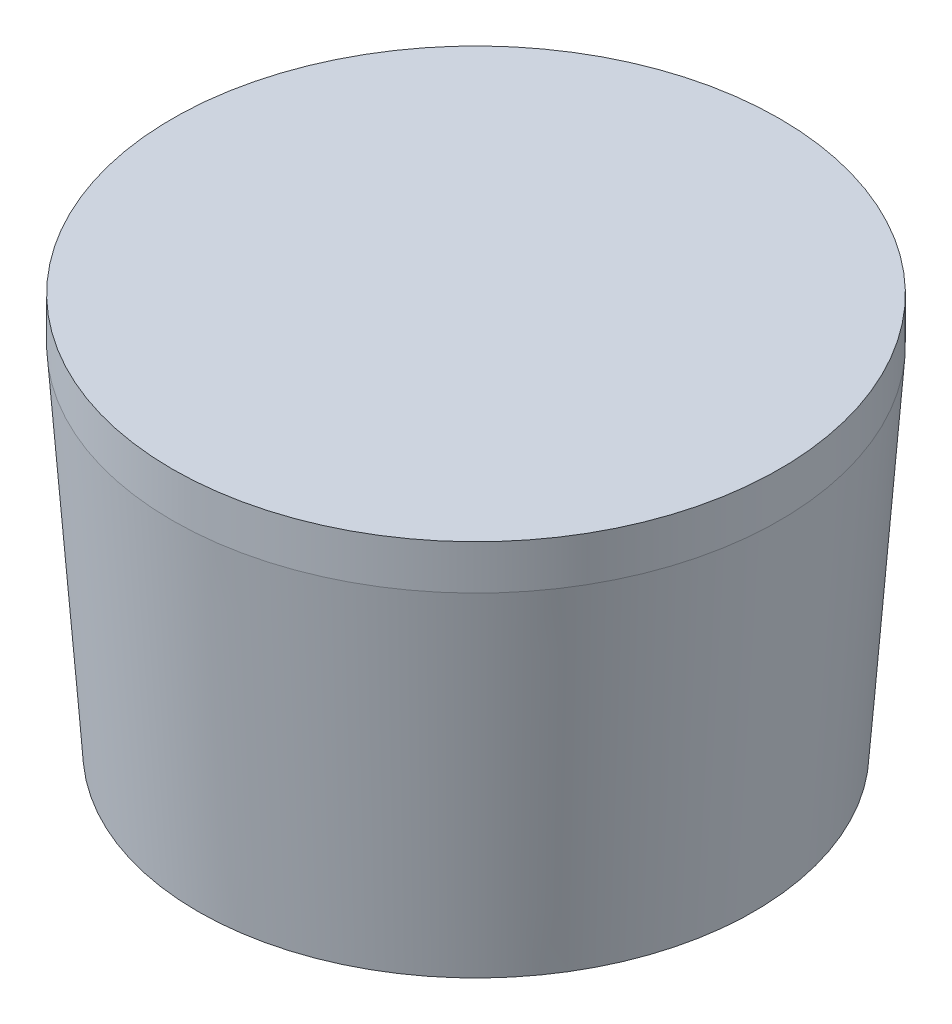
ISO-10303-21;
HEADER;
FILE_DESCRIPTION(('STEP AP214'),'2;1');
FILE_NAME('part.step','',(''),(''),'','','');
FILE_SCHEMA(('AUTOMOTIVE_DESIGN { 1 0 10303 214 1 1 1 1 }'));
ENDSEC;
DATA;
#1=APPLICATION_CONTEXT('core data for automotive mechanical design processes');
#2=APPLICATION_PROTOCOL_DEFINITION('international standard','automotive_design',2000,#1);
#3=PRODUCT_CONTEXT('',#1,'mechanical');
#4=PRODUCT('Part','Part','',(#3));
#5=PRODUCT_RELATED_PRODUCT_CATEGORY('part','',(#4));
#6=PRODUCT_DEFINITION_FORMATION('','',#4);
#7=PRODUCT_DEFINITION_CONTEXT('part definition',#1,'design');
#8=PRODUCT_DEFINITION('design','',#6,#7);
#9=PRODUCT_DEFINITION_SHAPE('','',#8);
#10=(LENGTH_UNIT() NAMED_UNIT(*) SI_UNIT(.MILLI.,.METRE.));
#11=(NAMED_UNIT(*) PLANE_ANGLE_UNIT() SI_UNIT($,.RADIAN.));
#12=(NAMED_UNIT(*) SI_UNIT($,.STERADIAN.) SOLID_ANGLE_UNIT());
#13=UNCERTAINTY_MEASURE_WITH_UNIT(LENGTH_MEASURE(1.E-05),#10,'distance_accuracy_value','');
#14=(GEOMETRIC_REPRESENTATION_CONTEXT(3) GLOBAL_UNCERTAINTY_ASSIGNED_CONTEXT((#13)) GLOBAL_UNIT_ASSIGNED_CONTEXT((#10,
#11,#12)) REPRESENTATION_CONTEXT('',''));
#15=CARTESIAN_POINT('',(0.,0.,0.));
#16=DIRECTION('',(0.,0.,1.));
#17=DIRECTION('',(1.,0.,0.));
#18=AXIS2_PLACEMENT_3D('',#15,#16,#17);
#19=CARTESIAN_POINT('',(0.,0.,0.));
#20=DIRECTION('',(0.,1.,0.));
#21=DIRECTION('',(0.,0.,1.));
#22=AXIS2_PLACEMENT_3D('',#19,#20,#21);
#23=PLANE('',#22);
#24=CARTESIAN_POINT('',(0.,0.,0.));
#25=DIRECTION('',(0.,-1.,0.));
#26=DIRECTION('',(0.,0.,-1.));
#27=AXIS2_PLACEMENT_3D('',#24,#25,#26);
#28=CIRCLE('',#27,79.);
#29=CARTESIAN_POINT('',(0.,0.,-79.));
#30=VERTEX_POINT('',#29);
#31=EDGE_CURVE('E103',#30,#30,#28,.T.);
#32=ORIENTED_EDGE('',*,*,#31,.F.);
#33=EDGE_LOOP('',(#32));
#34=FACE_BOUND('',#33,.T.);
#35=CARTESIAN_POINT('',(0.,0.,0.));
#36=DIRECTION('',(0.,1.,0.));
#37=DIRECTION('',(0.,0.,1.));
#38=AXIS2_PLACEMENT_3D('',#35,#36,#37);
#39=CIRCLE('',#38,125.);
#40=CARTESIAN_POINT('',(0.,0.,125.));
#41=VERTEX_POINT('',#40);
#42=EDGE_CURVE('E11',#41,#41,#39,.T.);
#43=ORIENTED_EDGE('',*,*,#42,.F.);
#44=EDGE_LOOP('',(#43));
#45=FACE_BOUND('',#44,.T.);
#46=ADVANCED_FACE('F35',(#34,#45),#23,.F.);
#47=CARTESIAN_POINT('',(0.,0.,0.));
#48=DIRECTION('',(0.,1.,0.));
#49=DIRECTION('',(0.,0.,1.));
#50=AXIS2_PLACEMENT_3D('',#47,#48,#49);
#51=CONICAL_SURFACE('',#50,125.,0.0726566881626666);
#52=CARTESIAN_POINT('',(0.,158.,0.));
#53=DIRECTION('',(0.,1.,0.));
#54=DIRECTION('',(0.,0.,1.));
#55=AXIS2_PLACEMENT_3D('',#52,#53,#54);
#56=CIRCLE('',#55,136.5);
#57=CARTESIAN_POINT('',(0.,158.,136.5));
#58=VERTEX_POINT('',#57);
#59=EDGE_CURVE('E43',#58,#58,#56,.T.);
#60=ORIENTED_EDGE('',*,*,#59,.F.);
#61=EDGE_LOOP('',(#60));
#62=FACE_BOUND('',#61,.T.);
#63=ORIENTED_EDGE('',*,*,#42,.T.);
#64=EDGE_LOOP('',(#63));
#65=FACE_BOUND('',#64,.T.);
#66=ADVANCED_FACE('F75',(#62,#65),#51,.T.);
#67=CARTESIAN_POINT('',(0.,178.,0.));
#68=DIRECTION('',(0.,-1.,0.));
#69=DIRECTION('',(0.,0.,-1.));
#70=AXIS2_PLACEMENT_3D('',#67,#68,#69);
#71=CYLINDRICAL_SURFACE('',#70,136.5);
#72=CARTESIAN_POINT('',(0.,178.,0.));
#73=DIRECTION('',(0.,1.,0.));
#74=DIRECTION('',(0.,0.,1.));
#75=AXIS2_PLACEMENT_3D('',#72,#73,#74);
#76=CIRCLE('',#75,136.5);
#77=CARTESIAN_POINT('',(0.,178.,136.5));
#78=VERTEX_POINT('',#77);
#79=EDGE_CURVE('E49',#78,#78,#76,.T.);
#80=ORIENTED_EDGE('',*,*,#79,.F.);
#81=EDGE_LOOP('',(#80));
#82=FACE_BOUND('',#81,.T.);
#83=ORIENTED_EDGE('',*,*,#59,.T.);
#84=EDGE_LOOP('',(#83));
#85=FACE_BOUND('',#84,.T.);
#86=ADVANCED_FACE('F64',(#82,#85),#71,.T.);
#87=CARTESIAN_POINT('',(0.,178.,0.));
#88=DIRECTION('',(0.,1.,0.));
#89=DIRECTION('',(0.,0.,1.));
#90=AXIS2_PLACEMENT_3D('',#87,#88,#89);
#91=PLANE('',#90);
#92=ORIENTED_EDGE('',*,*,#79,.T.);
#93=EDGE_LOOP('',(#92));
#94=FACE_BOUND('',#93,.T.);
#95=ADVANCED_FACE('F74',(#94),#91,.T.);
#96=CARTESIAN_POINT('',(0.,12.5,0.));
#97=DIRECTION('',(0.,-1.,0.));
#98=DIRECTION('',(0.,0.,-1.));
#99=AXIS2_PLACEMENT_3D('',#96,#97,#98);
#100=CYLINDRICAL_SURFACE('',#99,79.);
#101=CARTESIAN_POINT('',(0.,12.5,0.));
#102=DIRECTION('',(0.,-1.,0.));
#103=DIRECTION('',(0.,0.,-1.));
#104=AXIS2_PLACEMENT_3D('',#101,#102,#103);
#105=CIRCLE('',#104,79.);
#106=CARTESIAN_POINT('',(0.,12.5,-79.));
#107=VERTEX_POINT('',#106);
#108=EDGE_CURVE('E39',#107,#107,#105,.T.);
#109=ORIENTED_EDGE('',*,*,#108,.F.);
#110=EDGE_LOOP('',(#109));
#111=FACE_BOUND('',#110,.T.);
#112=ORIENTED_EDGE('',*,*,#31,.T.);
#113=EDGE_LOOP('',(#112));
#114=FACE_BOUND('',#113,.T.);
#115=ADVANCED_FACE('F112',(#111,#114),#100,.F.);
#116=CARTESIAN_POINT('',(0.,-609.1,0.));
#117=DIRECTION('',(0.,0.,1.));
#118=DIRECTION('',(1.,0.,0.));
#119=AXIS2_PLACEMENT_3D('',#116,#117,#118);
#120=SPHERICAL_SURFACE('',#119,626.6);
#121=CARTESIAN_POINT('',(0.,-609.1,0.));
#122=DIRECTION('',(0.,-1.,0.));
#123=DIRECTION('',(0.,0.,-1.));
#124=AXIS2_PLACEMENT_3D('',#121,#122,#123);
#125=SPHERICAL_SURFACE('',#124,626.6);
#126=ORIENTED_EDGE('',*,*,#108,.T.);
#127=EDGE_LOOP('',(#126));
#128=FACE_BOUND('',#127,.T.);
#129=ADVANCED_FACE('F37',(#128),#125,.F.);
#130=CLOSED_SHELL('',(#46,#66,#86,#95,#115,#129));
#131=MANIFOLD_SOLID_BREP('B2',#130);
#132=ADVANCED_BREP_SHAPE_REPRESENTATION('',(#18,#131),#14);
#133=SHAPE_DEFINITION_REPRESENTATION(#9,#132);
ENDSEC;
END-ISO-10303-21;
